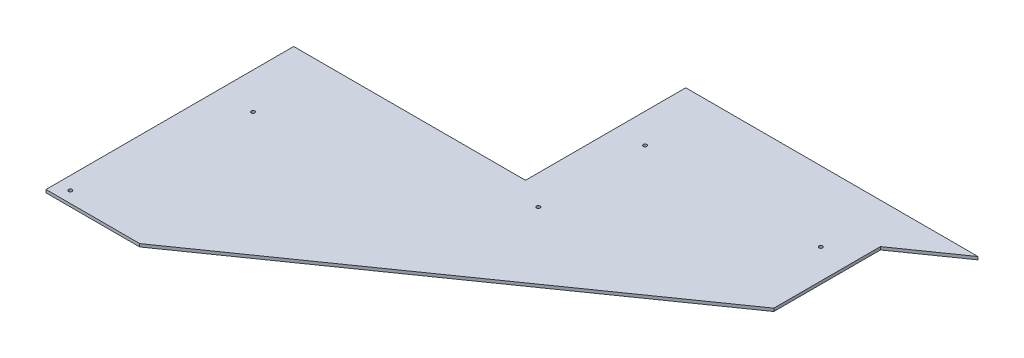
ISO-10303-21;
HEADER;
FILE_DESCRIPTION(('STEP AP214'),'2;1');
FILE_NAME('part.step','',(''),(''),'','','');
FILE_SCHEMA(('AUTOMOTIVE_DESIGN { 1 0 10303 214 1 1 1 1 }'));
ENDSEC;
DATA;
#1=APPLICATION_CONTEXT('core data for automotive mechanical design processes');
#2=APPLICATION_PROTOCOL_DEFINITION('international standard','automotive_design',2000,#1);
#3=PRODUCT_CONTEXT('',#1,'mechanical');
#4=PRODUCT('Part','Part','',(#3));
#5=PRODUCT_RELATED_PRODUCT_CATEGORY('part','',(#4));
#6=PRODUCT_DEFINITION_FORMATION('','',#4);
#7=PRODUCT_DEFINITION_CONTEXT('part definition',#1,'design');
#8=PRODUCT_DEFINITION('design','',#6,#7);
#9=PRODUCT_DEFINITION_SHAPE('','',#8);
#10=(LENGTH_UNIT() NAMED_UNIT(*) SI_UNIT(.MILLI.,.METRE.));
#11=(NAMED_UNIT(*) PLANE_ANGLE_UNIT() SI_UNIT($,.RADIAN.));
#12=(NAMED_UNIT(*) SI_UNIT($,.STERADIAN.) SOLID_ANGLE_UNIT());
#13=UNCERTAINTY_MEASURE_WITH_UNIT(LENGTH_MEASURE(1.E-05),#10,'distance_accuracy_value','');
#14=(GEOMETRIC_REPRESENTATION_CONTEXT(3) GLOBAL_UNCERTAINTY_ASSIGNED_CONTEXT((#13)) GLOBAL_UNIT_ASSIGNED_CONTEXT((#10,
#11,#12)) REPRESENTATION_CONTEXT('',''));
#15=CARTESIAN_POINT('',(0.,0.,0.));
#16=DIRECTION('',(0.,0.,1.));
#17=DIRECTION('',(1.,0.,0.));
#18=AXIS2_PLACEMENT_3D('',#15,#16,#17);
#19=CARTESIAN_POINT('',(0.,5.588,0.));
#20=DIRECTION('',(0.,-1.,0.));
#21=DIRECTION('',(0.,0.,-1.));
#22=AXIS2_PLACEMENT_3D('',#19,#20,#21);
#23=PLANE('',#22);
#24=DIRECTION('',(1.,0.,0.));
#25=VECTOR('',#24,1.);
#26=CARTESIAN_POINT('',(177.8,5.588,0.));
#27=LINE('',#26,#25);
#28=CARTESIAN_POINT('',(0.,5.588,0.));
#29=VERTEX_POINT('',#28);
#30=CARTESIAN_POINT('',(177.8,5.588,0.));
#31=VERTEX_POINT('',#30);
#32=EDGE_CURVE('E145',#29,#31,#27,.T.);
#33=ORIENTED_EDGE('',*,*,#32,.T.);
#34=DIRECTION('',(0.819152044288991,0.,-0.573576436351047));
#35=VECTOR('',#34,1.);
#36=CARTESIAN_POINT('',(885.3805,5.588,-495.453199990197));
#37=LINE('',#36,#35);
#38=CARTESIAN_POINT('',(885.3805,5.588,-495.453199990197));
#39=VERTEX_POINT('',#38);
#40=EDGE_CURVE('E93',#31,#39,#37,.T.);
#41=ORIENTED_EDGE('',*,*,#40,.T.);
#42=DIRECTION('',(0.,0.,-1.));
#43=VECTOR('',#42,1.);
#44=CARTESIAN_POINT('',(885.3805,5.588,-697.738));
#45=LINE('',#44,#43);
#46=CARTESIAN_POINT('',(885.3805,5.588,-697.738));
#47=VERTEX_POINT('',#46);
#48=EDGE_CURVE('E160',#39,#47,#45,.T.);
#49=ORIENTED_EDGE('',*,*,#48,.T.);
#50=DIRECTION('',(0.819152044288993,0.,-0.573576436351045));
#51=VECTOR('',#50,1.);
#52=CARTESIAN_POINT('',(994.20537811375,5.588,-773.938));
#53=LINE('',#52,#51);
#54=CARTESIAN_POINT('',(994.20537811375,5.588,-773.938));
#55=VERTEX_POINT('',#54);
#56=EDGE_CURVE('E173',#47,#55,#53,.T.);
#57=ORIENTED_EDGE('',*,*,#56,.T.);
#58=DIRECTION('',(-1.,0.,0.));
#59=VECTOR('',#58,1.);
#60=CARTESIAN_POINT('',(439.7375,5.588,-773.938));
#61=LINE('',#60,#59);
#62=CARTESIAN_POINT('',(439.7375,5.588,-773.938));
#63=VERTEX_POINT('',#62);
#64=EDGE_CURVE('E112',#55,#63,#61,.T.);
#65=ORIENTED_EDGE('',*,*,#64,.T.);
#66=DIRECTION('',(0.,0.,1.));
#67=VECTOR('',#66,1.);
#68=CARTESIAN_POINT('',(439.7375,5.588,-469.9));
#69=LINE('',#68,#67);
#70=CARTESIAN_POINT('',(439.7375,5.588,-469.9));
#71=VERTEX_POINT('',#70);
#72=EDGE_CURVE('E106',#63,#71,#69,.T.);
#73=ORIENTED_EDGE('',*,*,#72,.T.);
#74=DIRECTION('',(-1.,0.,0.));
#75=VECTOR('',#74,1.);
#76=CARTESIAN_POINT('',(0.,5.588,-469.9));
#77=LINE('',#76,#75);
#78=CARTESIAN_POINT('',(0.,5.588,-469.9));
#79=VERTEX_POINT('',#78);
#80=EDGE_CURVE('E110',#71,#79,#77,.T.);
#81=ORIENTED_EDGE('',*,*,#80,.T.);
#82=DIRECTION('',(0.,0.,1.));
#83=VECTOR('',#82,1.);
#84=CARTESIAN_POINT('',(0.,5.588,0.));
#85=LINE('',#84,#83);
#86=EDGE_CURVE('E50',#79,#29,#85,.T.);
#87=ORIENTED_EDGE('',*,*,#86,.T.);
#88=EDGE_LOOP('',(#33,#41,#49,#57,#65,#73,#81,#87));
#89=FACE_BOUND('',#88,.T.);
#90=CARTESIAN_POINT('',(495.8715,5.588,-438.15));
#91=DIRECTION('',(0.,1.,0.));
#92=DIRECTION('',(0.,0.,1.));
#93=AXIS2_PLACEMENT_3D('',#90,#91,#92);
#94=CIRCLE('',#93,3.37819999999999);
#95=CARTESIAN_POINT('',(495.8715,5.588,-434.7718));
#96=VERTEX_POINT('',#95);
#97=EDGE_CURVE('E134',#96,#96,#94,.T.);
#98=ORIENTED_EDGE('',*,*,#97,.F.);
#99=EDGE_LOOP('',(#98));
#100=FACE_BOUND('',#99,.T.);
#101=CARTESIAN_POINT('',(24.6253,5.588,-21.463));
#102=DIRECTION('',(0.,1.,0.));
#103=DIRECTION('',(0.,0.,1.));
#104=AXIS2_PLACEMENT_3D('',#101,#102,#103);
#105=CIRCLE('',#104,3.3782);
#106=CARTESIAN_POINT('',(24.6253,5.588,-18.0848));
#107=VERTEX_POINT('',#106);
#108=EDGE_CURVE('E182',#107,#107,#105,.T.);
#109=ORIENTED_EDGE('',*,*,#108,.F.);
#110=EDGE_LOOP('',(#109));
#111=FACE_BOUND('',#110,.T.);
#112=CARTESIAN_POINT('',(495.8715,5.588,-640.588));
#113=DIRECTION('',(0.,1.,0.));
#114=DIRECTION('',(0.,0.,1.));
#115=AXIS2_PLACEMENT_3D('',#112,#113,#114);
#116=CIRCLE('',#115,3.37819999999999);
#117=CARTESIAN_POINT('',(495.8715,5.588,-637.2098));
#118=VERTEX_POINT('',#117);
#119=EDGE_CURVE('E188',#118,#118,#116,.T.);
#120=ORIENTED_EDGE('',*,*,#119,.F.);
#121=EDGE_LOOP('',(#120));
#122=FACE_BOUND('',#121,.T.);
#123=CARTESIAN_POINT('',(69.0753,5.588,-323.85));
#124=DIRECTION('',(0.,1.,0.));
#125=DIRECTION('',(0.,0.,1.));
#126=AXIS2_PLACEMENT_3D('',#123,#124,#125);
#127=CIRCLE('',#126,3.37819999999999);
#128=CARTESIAN_POINT('',(69.0753,5.588,-320.4718));
#129=VERTEX_POINT('',#128);
#130=EDGE_CURVE('E194',#129,#129,#127,.T.);
#131=ORIENTED_EDGE('',*,*,#130,.F.);
#132=EDGE_LOOP('',(#131));
#133=FACE_BOUND('',#132,.T.);
#134=CARTESIAN_POINT('',(829.2465,5.588,-640.588));
#135=DIRECTION('',(0.,1.,0.));
#136=DIRECTION('',(0.,0.,1.));
#137=AXIS2_PLACEMENT_3D('',#134,#135,#136);
#138=CIRCLE('',#137,3.37819999999999);
#139=CARTESIAN_POINT('',(829.2465,5.588,-637.2098));
#140=VERTEX_POINT('',#139);
#141=EDGE_CURVE('E200',#140,#140,#138,.T.);
#142=ORIENTED_EDGE('',*,*,#141,.F.);
#143=EDGE_LOOP('',(#142));
#144=FACE_BOUND('',#143,.T.);
#145=ADVANCED_FACE('F33',(#89,#100,#111,#122,#133,#144),#23,.F.);
#146=CARTESIAN_POINT('',(0.,0.,0.));
#147=DIRECTION('',(0.,-1.,0.));
#148=DIRECTION('',(0.,0.,-1.));
#149=AXIS2_PLACEMENT_3D('',#146,#147,#148);
#150=PLANE('',#149);
#151=CARTESIAN_POINT('',(69.0753,0.,-323.85));
#152=DIRECTION('',(0.,1.,0.));
#153=DIRECTION('',(0.,0.,1.));
#154=AXIS2_PLACEMENT_3D('',#151,#152,#153);
#155=CIRCLE('',#154,3.37819999999999);
#156=CARTESIAN_POINT('',(69.0753,0.,-320.4718));
#157=VERTEX_POINT('',#156);
#158=EDGE_CURVE('E197',#157,#157,#155,.T.);
#159=ORIENTED_EDGE('',*,*,#158,.T.);
#160=EDGE_LOOP('',(#159));
#161=FACE_BOUND('',#160,.T.);
#162=CARTESIAN_POINT('',(24.6253,0.,-21.463));
#163=DIRECTION('',(0.,1.,0.));
#164=DIRECTION('',(0.,0.,1.));
#165=AXIS2_PLACEMENT_3D('',#162,#163,#164);
#166=CIRCLE('',#165,3.3782);
#167=CARTESIAN_POINT('',(24.6253,0.,-18.0848));
#168=VERTEX_POINT('',#167);
#169=EDGE_CURVE('E185',#168,#168,#166,.T.);
#170=ORIENTED_EDGE('',*,*,#169,.T.);
#171=EDGE_LOOP('',(#170));
#172=FACE_BOUND('',#171,.T.);
#173=DIRECTION('',(1.,0.,0.));
#174=VECTOR('',#173,1.);
#175=CARTESIAN_POINT('',(177.8,0.,0.));
#176=LINE('',#175,#174);
#177=CARTESIAN_POINT('',(0.,0.,0.));
#178=VERTEX_POINT('',#177);
#179=CARTESIAN_POINT('',(177.8,0.,0.));
#180=VERTEX_POINT('',#179);
#181=EDGE_CURVE('E130',#178,#180,#176,.T.);
#182=ORIENTED_EDGE('',*,*,#181,.F.);
#183=DIRECTION('',(0.,0.,1.));
#184=VECTOR('',#183,1.);
#185=CARTESIAN_POINT('',(0.,0.,0.));
#186=LINE('',#185,#184);
#187=CARTESIAN_POINT('',(0.,0.,-469.9));
#188=VERTEX_POINT('',#187);
#189=EDGE_CURVE('E85',#188,#178,#186,.T.);
#190=ORIENTED_EDGE('',*,*,#189,.F.);
#191=DIRECTION('',(-1.,0.,0.));
#192=VECTOR('',#191,1.);
#193=CARTESIAN_POINT('',(0.,0.,-469.9));
#194=LINE('',#193,#192);
#195=CARTESIAN_POINT('',(439.7375,0.,-469.9));
#196=VERTEX_POINT('',#195);
#197=EDGE_CURVE('E79',#196,#188,#194,.T.);
#198=ORIENTED_EDGE('',*,*,#197,.F.);
#199=DIRECTION('',(0.,0.,1.));
#200=VECTOR('',#199,1.);
#201=CARTESIAN_POINT('',(439.7375,0.,-469.9));
#202=LINE('',#201,#200);
#203=CARTESIAN_POINT('',(439.7375,0.,-773.938));
#204=VERTEX_POINT('',#203);
#205=EDGE_CURVE('E120',#204,#196,#202,.T.);
#206=ORIENTED_EDGE('',*,*,#205,.F.);
#207=DIRECTION('',(-1.,0.,0.));
#208=VECTOR('',#207,1.);
#209=CARTESIAN_POINT('',(439.7375,0.,-773.938));
#210=LINE('',#209,#208);
#211=CARTESIAN_POINT('',(994.20537811375,0.,-773.938));
#212=VERTEX_POINT('',#211);
#213=EDGE_CURVE('E140',#212,#204,#210,.T.);
#214=ORIENTED_EDGE('',*,*,#213,.F.);
#215=DIRECTION('',(0.819152044288993,0.,-0.573576436351045));
#216=VECTOR('',#215,1.);
#217=CARTESIAN_POINT('',(994.20537811375,0.,-773.938));
#218=LINE('',#217,#216);
#219=CARTESIAN_POINT('',(885.3805,0.,-697.738));
#220=VERTEX_POINT('',#219);
#221=EDGE_CURVE('E138',#220,#212,#218,.T.);
#222=ORIENTED_EDGE('',*,*,#221,.F.);
#223=DIRECTION('',(0.,0.,-1.));
#224=VECTOR('',#223,1.);
#225=CARTESIAN_POINT('',(885.3805,0.,-697.738));
#226=LINE('',#225,#224);
#227=CARTESIAN_POINT('',(885.3805,0.,-495.453199990197));
#228=VERTEX_POINT('',#227);
#229=EDGE_CURVE('E136',#228,#220,#226,.T.);
#230=ORIENTED_EDGE('',*,*,#229,.F.);
#231=DIRECTION('',(0.819152044288991,0.,-0.573576436351047));
#232=VECTOR('',#231,1.);
#233=CARTESIAN_POINT('',(885.3805,0.,-495.453199990197));
#234=LINE('',#233,#232);
#235=EDGE_CURVE('E133',#180,#228,#234,.T.);
#236=ORIENTED_EDGE('',*,*,#235,.F.);
#237=EDGE_LOOP('',(#182,#190,#198,#206,#214,#222,#230,#236));
#238=FACE_BOUND('',#237,.T.);
#239=CARTESIAN_POINT('',(495.8715,0.,-438.15));
#240=DIRECTION('',(0.,1.,0.));
#241=DIRECTION('',(0.,0.,1.));
#242=AXIS2_PLACEMENT_3D('',#239,#240,#241);
#243=CIRCLE('',#242,3.37819999999999);
#244=CARTESIAN_POINT('',(495.8715,0.,-434.7718));
#245=VERTEX_POINT('',#244);
#246=EDGE_CURVE('E179',#245,#245,#243,.T.);
#247=ORIENTED_EDGE('',*,*,#246,.T.);
#248=EDGE_LOOP('',(#247));
#249=FACE_BOUND('',#248,.T.);
#250=CARTESIAN_POINT('',(495.8715,0.,-640.588));
#251=DIRECTION('',(0.,1.,0.));
#252=DIRECTION('',(0.,0.,1.));
#253=AXIS2_PLACEMENT_3D('',#250,#251,#252);
#254=CIRCLE('',#253,3.37819999999999);
#255=CARTESIAN_POINT('',(495.8715,0.,-637.2098));
#256=VERTEX_POINT('',#255);
#257=EDGE_CURVE('E191',#256,#256,#254,.T.);
#258=ORIENTED_EDGE('',*,*,#257,.T.);
#259=EDGE_LOOP('',(#258));
#260=FACE_BOUND('',#259,.T.);
#261=CARTESIAN_POINT('',(829.2465,0.,-640.588));
#262=DIRECTION('',(0.,1.,0.));
#263=DIRECTION('',(0.,0.,1.));
#264=AXIS2_PLACEMENT_3D('',#261,#262,#263);
#265=CIRCLE('',#264,3.37819999999999);
#266=CARTESIAN_POINT('',(829.2465,0.,-637.2098));
#267=VERTEX_POINT('',#266);
#268=EDGE_CURVE('E203',#267,#267,#265,.T.);
#269=ORIENTED_EDGE('',*,*,#268,.T.);
#270=EDGE_LOOP('',(#269));
#271=FACE_BOUND('',#270,.T.);
#272=ADVANCED_FACE('F164',(#161,#172,#238,#249,#260,#271),#150,.T.);
#273=CARTESIAN_POINT('',(177.8,5.588,0.));
#274=DIRECTION('',(0.,0.,-1.));
#275=DIRECTION('',(-1.,0.,0.));
#276=AXIS2_PLACEMENT_3D('',#273,#274,#275);
#277=PLANE('',#276);
#278=ORIENTED_EDGE('',*,*,#181,.T.);
#279=DIRECTION('',(0.,-1.,0.));
#280=VECTOR('',#279,1.);
#281=CARTESIAN_POINT('',(177.8,5.588,0.));
#282=LINE('',#281,#280);
#283=EDGE_CURVE('E11',#31,#180,#282,.T.);
#284=ORIENTED_EDGE('',*,*,#283,.F.);
#285=ORIENTED_EDGE('',*,*,#32,.F.);
#286=DIRECTION('',(0.,-1.,0.));
#287=VECTOR('',#286,1.);
#288=CARTESIAN_POINT('',(0.,5.588,0.));
#289=LINE('',#288,#287);
#290=EDGE_CURVE('E126',#29,#178,#289,.T.);
#291=ORIENTED_EDGE('',*,*,#290,.T.);
#292=EDGE_LOOP('',(#278,#284,#285,#291));
#293=FACE_BOUND('',#292,.T.);
#294=ADVANCED_FACE('F35',(#293),#277,.F.);
#295=CARTESIAN_POINT('',(885.3805,5.588,-495.453199990197));
#296=DIRECTION('',(-0.573576436351047,0.,-0.819152044288991));
#297=DIRECTION('',(-0.819152044288991,0.,0.573576436351047));
#298=AXIS2_PLACEMENT_3D('',#295,#296,#297);
#299=PLANE('',#298);
#300=ORIENTED_EDGE('',*,*,#235,.T.);
#301=DIRECTION('',(0.,-1.,0.));
#302=VECTOR('',#301,1.);
#303=CARTESIAN_POINT('',(885.3805,5.588,-495.453199990197));
#304=LINE('',#303,#302);
#305=EDGE_CURVE('E42',#39,#228,#304,.T.);
#306=ORIENTED_EDGE('',*,*,#305,.F.);
#307=ORIENTED_EDGE('',*,*,#40,.F.);
#308=ORIENTED_EDGE('',*,*,#283,.T.);
#309=EDGE_LOOP('',(#300,#306,#307,#308));
#310=FACE_BOUND('',#309,.T.);
#311=ADVANCED_FACE('F235',(#310),#299,.F.);
#312=CARTESIAN_POINT('',(885.3805,5.588,-697.738));
#313=DIRECTION('',(-1.,0.,0.));
#314=DIRECTION('',(0.,0.,1.));
#315=AXIS2_PLACEMENT_3D('',#312,#313,#314);
#316=PLANE('',#315);
#317=ORIENTED_EDGE('',*,*,#229,.T.);
#318=DIRECTION('',(0.,-1.,0.));
#319=VECTOR('',#318,1.);
#320=CARTESIAN_POINT('',(885.3805,5.588,-697.738));
#321=LINE('',#320,#319);
#322=EDGE_CURVE('E152',#47,#220,#321,.T.);
#323=ORIENTED_EDGE('',*,*,#322,.F.);
#324=ORIENTED_EDGE('',*,*,#48,.F.);
#325=ORIENTED_EDGE('',*,*,#305,.T.);
#326=EDGE_LOOP('',(#317,#323,#324,#325));
#327=FACE_BOUND('',#326,.T.);
#328=ADVANCED_FACE('F158',(#327),#316,.F.);
#329=CARTESIAN_POINT('',(994.20537811375,5.588,-773.938));
#330=DIRECTION('',(-0.573576436351045,0.,-0.819152044288993));
#331=DIRECTION('',(-0.819152044288993,0.,0.573576436351045));
#332=AXIS2_PLACEMENT_3D('',#329,#330,#331);
#333=PLANE('',#332);
#334=ORIENTED_EDGE('',*,*,#221,.T.);
#335=DIRECTION('',(0.,-1.,0.));
#336=VECTOR('',#335,1.);
#337=CARTESIAN_POINT('',(994.20537811375,5.588,-773.938));
#338=LINE('',#337,#336);
#339=EDGE_CURVE('E149',#55,#212,#338,.T.);
#340=ORIENTED_EDGE('',*,*,#339,.F.);
#341=ORIENTED_EDGE('',*,*,#56,.F.);
#342=ORIENTED_EDGE('',*,*,#322,.T.);
#343=EDGE_LOOP('',(#334,#340,#341,#342));
#344=FACE_BOUND('',#343,.T.);
#345=ADVANCED_FACE('F169',(#344),#333,.F.);
#346=CARTESIAN_POINT('',(439.7375,5.588,-773.938));
#347=DIRECTION('',(0.,0.,1.));
#348=DIRECTION('',(1.,0.,0.));
#349=AXIS2_PLACEMENT_3D('',#346,#347,#348);
#350=PLANE('',#349);
#351=ORIENTED_EDGE('',*,*,#213,.T.);
#352=DIRECTION('',(0.,-1.,0.));
#353=VECTOR('',#352,1.);
#354=CARTESIAN_POINT('',(439.7375,5.588,-773.938));
#355=LINE('',#354,#353);
#356=EDGE_CURVE('E121',#63,#204,#355,.T.);
#357=ORIENTED_EDGE('',*,*,#356,.F.);
#358=ORIENTED_EDGE('',*,*,#64,.F.);
#359=ORIENTED_EDGE('',*,*,#339,.T.);
#360=EDGE_LOOP('',(#351,#357,#358,#359));
#361=FACE_BOUND('',#360,.T.);
#362=ADVANCED_FACE('F172',(#361),#350,.F.);
#363=CARTESIAN_POINT('',(439.7375,5.588,-469.9));
#364=DIRECTION('',(1.,0.,0.));
#365=DIRECTION('',(0.,0.,-1.));
#366=AXIS2_PLACEMENT_3D('',#363,#364,#365);
#367=PLANE('',#366);
#368=ORIENTED_EDGE('',*,*,#205,.T.);
#369=DIRECTION('',(0.,-1.,0.));
#370=VECTOR('',#369,1.);
#371=CARTESIAN_POINT('',(439.7375,5.588,-469.9));
#372=LINE('',#371,#370);
#373=EDGE_CURVE('E117',#71,#196,#372,.T.);
#374=ORIENTED_EDGE('',*,*,#373,.F.);
#375=ORIENTED_EDGE('',*,*,#72,.F.);
#376=ORIENTED_EDGE('',*,*,#356,.T.);
#377=EDGE_LOOP('',(#368,#374,#375,#376));
#378=FACE_BOUND('',#377,.T.);
#379=ADVANCED_FACE('F118',(#378),#367,.F.);
#380=CARTESIAN_POINT('',(0.,5.588,-469.9));
#381=DIRECTION('',(0.,0.,1.));
#382=DIRECTION('',(1.,0.,0.));
#383=AXIS2_PLACEMENT_3D('',#380,#381,#382);
#384=PLANE('',#383);
#385=ORIENTED_EDGE('',*,*,#197,.T.);
#386=DIRECTION('',(0.,-1.,0.));
#387=VECTOR('',#386,1.);
#388=CARTESIAN_POINT('',(0.,5.588,-469.9));
#389=LINE('',#388,#387);
#390=EDGE_CURVE('E122',#79,#188,#389,.T.);
#391=ORIENTED_EDGE('',*,*,#390,.F.);
#392=ORIENTED_EDGE('',*,*,#80,.F.);
#393=ORIENTED_EDGE('',*,*,#373,.T.);
#394=EDGE_LOOP('',(#385,#391,#392,#393));
#395=FACE_BOUND('',#394,.T.);
#396=ADVANCED_FACE('F124',(#395),#384,.F.);
#397=CARTESIAN_POINT('',(0.,5.588,0.));
#398=DIRECTION('',(1.,0.,0.));
#399=DIRECTION('',(0.,0.,-1.));
#400=AXIS2_PLACEMENT_3D('',#397,#398,#399);
#401=PLANE('',#400);
#402=ORIENTED_EDGE('',*,*,#189,.T.);
#403=ORIENTED_EDGE('',*,*,#290,.F.);
#404=ORIENTED_EDGE('',*,*,#86,.F.);
#405=ORIENTED_EDGE('',*,*,#390,.T.);
#406=EDGE_LOOP('',(#402,#403,#404,#405));
#407=FACE_BOUND('',#406,.T.);
#408=ADVANCED_FACE('F223',(#407),#401,.F.);
#409=CARTESIAN_POINT('',(495.8715,5.588,-438.15));
#410=DIRECTION('',(0.,-1.,0.));
#411=DIRECTION('',(0.,0.,-1.));
#412=AXIS2_PLACEMENT_3D('',#409,#410,#411);
#413=CYLINDRICAL_SURFACE('',#412,3.37819999999999);
#414=ORIENTED_EDGE('',*,*,#97,.T.);
#415=EDGE_LOOP('',(#414));
#416=FACE_BOUND('',#415,.T.);
#417=ORIENTED_EDGE('',*,*,#246,.F.);
#418=EDGE_LOOP('',(#417));
#419=FACE_BOUND('',#418,.T.);
#420=ADVANCED_FACE('F220',(#416,#419),#413,.F.);
#421=CARTESIAN_POINT('',(24.6253,5.588,-21.463));
#422=DIRECTION('',(0.,-1.,0.));
#423=DIRECTION('',(0.,0.,-1.));
#424=AXIS2_PLACEMENT_3D('',#421,#422,#423);
#425=CYLINDRICAL_SURFACE('',#424,3.3782);
#426=ORIENTED_EDGE('',*,*,#108,.T.);
#427=EDGE_LOOP('',(#426));
#428=FACE_BOUND('',#427,.T.);
#429=ORIENTED_EDGE('',*,*,#169,.F.);
#430=EDGE_LOOP('',(#429));
#431=FACE_BOUND('',#430,.T.);
#432=ADVANCED_FACE('F299',(#428,#431),#425,.F.);
#433=CARTESIAN_POINT('',(495.8715,5.588,-640.588));
#434=DIRECTION('',(0.,-1.,0.));
#435=DIRECTION('',(0.,0.,-1.));
#436=AXIS2_PLACEMENT_3D('',#433,#434,#435);
#437=CYLINDRICAL_SURFACE('',#436,3.37819999999999);
#438=ORIENTED_EDGE('',*,*,#119,.T.);
#439=EDGE_LOOP('',(#438));
#440=FACE_BOUND('',#439,.T.);
#441=ORIENTED_EDGE('',*,*,#257,.F.);
#442=EDGE_LOOP('',(#441));
#443=FACE_BOUND('',#442,.T.);
#444=ADVANCED_FACE('F307',(#440,#443),#437,.F.);
#445=CARTESIAN_POINT('',(69.0753,5.588,-323.85));
#446=DIRECTION('',(0.,-1.,0.));
#447=DIRECTION('',(0.,0.,-1.));
#448=AXIS2_PLACEMENT_3D('',#445,#446,#447);
#449=CYLINDRICAL_SURFACE('',#448,3.37819999999999);
#450=ORIENTED_EDGE('',*,*,#130,.T.);
#451=EDGE_LOOP('',(#450));
#452=FACE_BOUND('',#451,.T.);
#453=ORIENTED_EDGE('',*,*,#158,.F.);
#454=EDGE_LOOP('',(#453));
#455=FACE_BOUND('',#454,.T.);
#456=ADVANCED_FACE('F315',(#452,#455),#449,.F.);
#457=CARTESIAN_POINT('',(829.2465,5.588,-640.588));
#458=DIRECTION('',(0.,-1.,0.));
#459=DIRECTION('',(0.,0.,-1.));
#460=AXIS2_PLACEMENT_3D('',#457,#458,#459);
#461=CYLINDRICAL_SURFACE('',#460,3.37819999999999);
#462=ORIENTED_EDGE('',*,*,#141,.T.);
#463=EDGE_LOOP('',(#462));
#464=FACE_BOUND('',#463,.T.);
#465=ORIENTED_EDGE('',*,*,#268,.F.);
#466=EDGE_LOOP('',(#465));
#467=FACE_BOUND('',#466,.T.);
#468=ADVANCED_FACE('F209',(#464,#467),#461,.F.);
#469=CLOSED_SHELL('',(#145,#272,#294,#311,#328,#345,#362,#379,#396,#408,#420,#432,#444,#456,#468));
#470=MANIFOLD_SOLID_BREP('B2',#469);
#471=ADVANCED_BREP_SHAPE_REPRESENTATION('',(#18,#470),#14);
#472=SHAPE_DEFINITION_REPRESENTATION(#9,#471);
ENDSEC;
END-ISO-10303-21;
